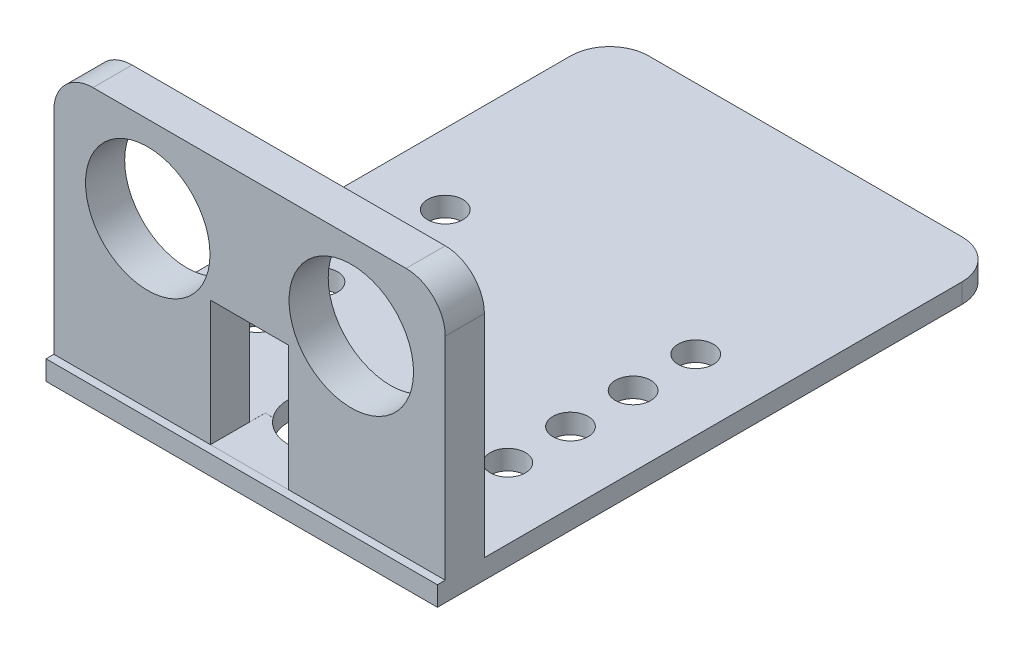
ISO-10303-21;
HEADER;
FILE_DESCRIPTION(('STEP AP214'),'2;1');
FILE_NAME('part.step','',(''),(''),'','','');
FILE_SCHEMA(('AUTOMOTIVE_DESIGN { 1 0 10303 214 1 1 1 1 }'));
ENDSEC;
DATA;
#1=APPLICATION_CONTEXT('core data for automotive mechanical design processes');
#2=APPLICATION_PROTOCOL_DEFINITION('international standard','automotive_design',2000,#1);
#3=PRODUCT_CONTEXT('',#1,'mechanical');
#4=PRODUCT('Part','Part','',(#3));
#5=PRODUCT_RELATED_PRODUCT_CATEGORY('part','',(#4));
#6=PRODUCT_DEFINITION_FORMATION('','',#4);
#7=PRODUCT_DEFINITION_CONTEXT('part definition',#1,'design');
#8=PRODUCT_DEFINITION('design','',#6,#7);
#9=PRODUCT_DEFINITION_SHAPE('','',#8);
#10=(LENGTH_UNIT() NAMED_UNIT(*) SI_UNIT(.MILLI.,.METRE.));
#11=(NAMED_UNIT(*) PLANE_ANGLE_UNIT() SI_UNIT($,.RADIAN.));
#12=(NAMED_UNIT(*) SI_UNIT($,.STERADIAN.) SOLID_ANGLE_UNIT());
#13=UNCERTAINTY_MEASURE_WITH_UNIT(LENGTH_MEASURE(1.E-05),#10,'distance_accuracy_value','');
#14=(GEOMETRIC_REPRESENTATION_CONTEXT(3) GLOBAL_UNCERTAINTY_ASSIGNED_CONTEXT((#13)) GLOBAL_UNIT_ASSIGNED_CONTEXT((#10,
#11,#12)) REPRESENTATION_CONTEXT('',''));
#15=CARTESIAN_POINT('',(0.,0.,0.));
#16=DIRECTION('',(0.,0.,1.));
#17=DIRECTION('',(1.,0.,0.));
#18=AXIS2_PLACEMENT_3D('',#15,#16,#17);
#19=CARTESIAN_POINT('',(0.,2.5,0.));
#20=DIRECTION('',(0.,-1.,0.));
#21=DIRECTION('',(0.,0.,-1.));
#22=AXIS2_PLACEMENT_3D('',#19,#20,#21);
#23=PLANE('',#22);
#24=DIRECTION('',(0.,0.,1.));
#25=VECTOR('',#24,1.);
#26=CARTESIAN_POINT('',(-25.,2.5,20.));
#27=LINE('',#26,#25);
#28=CARTESIAN_POINT('',(-25.,2.5,1.));
#29=VERTEX_POINT('',#28);
#30=CARTESIAN_POINT('',(-25.,2.5,2.));
#31=VERTEX_POINT('',#30);
#32=EDGE_CURVE('E312',#29,#31,#27,.T.);
#33=ORIENTED_EDGE('',*,*,#32,.T.);
#34=DIRECTION('',(1.,0.,0.));
#35=VECTOR('',#34,1.);
#36=CARTESIAN_POINT('',(-16.,2.5,2.));
#37=LINE('',#36,#35);
#38=CARTESIAN_POINT('',(25.,2.5,2.));
#39=VERTEX_POINT('',#38);
#40=EDGE_CURVE('E226',#31,#39,#37,.T.);
#41=ORIENTED_EDGE('',*,*,#40,.T.);
#42=DIRECTION('',(0.,0.,-1.));
#43=VECTOR('',#42,1.);
#44=CARTESIAN_POINT('',(25.,2.5,20.));
#45=LINE('',#44,#43);
#46=CARTESIAN_POINT('',(25.,2.5,1.));
#47=VERTEX_POINT('',#46);
#48=EDGE_CURVE('E209',#39,#47,#45,.T.);
#49=ORIENTED_EDGE('',*,*,#48,.T.);
#50=DIRECTION('',(1.,0.,0.));
#51=VECTOR('',#50,1.);
#52=CARTESIAN_POINT('',(0.,2.5,1.));
#53=LINE('',#52,#51);
#54=CARTESIAN_POINT('',(5.,2.5,1.));
#55=VERTEX_POINT('',#54);
#56=EDGE_CURVE('E233',#55,#47,#53,.T.);
#57=ORIENTED_EDGE('',*,*,#56,.F.);
#58=CARTESIAN_POINT('',(-5.,2.5,1.));
#59=VERTEX_POINT('',#58);
#60=EDGE_CURVE('E371',#59,#55,#53,.T.);
#61=ORIENTED_EDGE('',*,*,#60,.F.);
#62=EDGE_CURVE('E367',#29,#59,#53,.T.);
#63=ORIENTED_EDGE('',*,*,#62,.F.);
#64=EDGE_LOOP('',(#33,#41,#49,#57,#61,#63));
#65=FACE_BOUND('',#64,.T.);
#66=ADVANCED_FACE('F41',(#65),#23,.F.);
#67=CARTESIAN_POINT('',(16.,2.5,-24.));
#68=DIRECTION('',(0.,1.,0.));
#69=DIRECTION('',(0.,0.,-1.));
#70=AXIS2_PLACEMENT_3D('',#67,#68,#69);
#71=CIRCLE('',#70,2.25);
#72=CARTESIAN_POINT('',(16.,2.5,-26.25));
#73=VERTEX_POINT('',#72);
#74=EDGE_CURVE('E485',#73,#73,#71,.T.);
#75=ORIENTED_EDGE('',*,*,#74,.F.);
#76=EDGE_LOOP('',(#75));
#77=FACE_BOUND('',#76,.T.);
#78=CARTESIAN_POINT('',(16.0000000000001,2.5,-32.));
#79=DIRECTION('',(0.,1.,0.));
#80=DIRECTION('',(0.,0.,-1.));
#81=AXIS2_PLACEMENT_3D('',#78,#79,#80);
#82=CIRCLE('',#81,2.25);
#83=CARTESIAN_POINT('',(16.0000000000001,2.5,-34.25));
#84=VERTEX_POINT('',#83);
#85=EDGE_CURVE('E493',#84,#84,#82,.T.);
#86=ORIENTED_EDGE('',*,*,#85,.F.);
#87=EDGE_LOOP('',(#86));
#88=FACE_BOUND('',#87,.T.);
#89=CARTESIAN_POINT('',(16.0000000000001,2.5,-40.));
#90=DIRECTION('',(0.,1.,0.));
#91=DIRECTION('',(0.,0.,-1.));
#92=AXIS2_PLACEMENT_3D('',#89,#90,#91);
#93=CIRCLE('',#92,2.25);
#94=CARTESIAN_POINT('',(16.0000000000001,2.5,-42.25));
#95=VERTEX_POINT('',#94);
#96=EDGE_CURVE('E453',#95,#95,#93,.T.);
#97=ORIENTED_EDGE('',*,*,#96,.F.);
#98=EDGE_LOOP('',(#97));
#99=FACE_BOUND('',#98,.T.);
#100=CARTESIAN_POINT('',(-16.0000000000001,2.5,-40.));
#101=DIRECTION('',(0.,1.,0.));
#102=DIRECTION('',(0.,0.,1.));
#103=AXIS2_PLACEMENT_3D('',#100,#101,#102);
#104=CIRCLE('',#103,2.25);
#105=CARTESIAN_POINT('',(-16.0000000000001,2.5,-37.75));
#106=VERTEX_POINT('',#105);
#107=EDGE_CURVE('E462',#106,#106,#104,.T.);
#108=ORIENTED_EDGE('',*,*,#107,.F.);
#109=EDGE_LOOP('',(#108));
#110=FACE_BOUND('',#109,.T.);
#111=CARTESIAN_POINT('',(-16.0000000000001,2.5,-32.));
#112=DIRECTION('',(0.,1.,0.));
#113=DIRECTION('',(0.,0.,1.));
#114=AXIS2_PLACEMENT_3D('',#111,#112,#113);
#115=CIRCLE('',#114,2.25);
#116=CARTESIAN_POINT('',(-16.0000000000001,2.5,-29.75));
#117=VERTEX_POINT('',#116);
#118=EDGE_CURVE('E470',#117,#117,#115,.T.);
#119=ORIENTED_EDGE('',*,*,#118,.F.);
#120=EDGE_LOOP('',(#119));
#121=FACE_BOUND('',#120,.T.);
#122=CARTESIAN_POINT('',(-16.,2.5,-24.));
#123=DIRECTION('',(0.,1.,0.));
#124=DIRECTION('',(0.,0.,1.));
#125=AXIS2_PLACEMENT_3D('',#122,#123,#124);
#126=CIRCLE('',#125,2.25);
#127=CARTESIAN_POINT('',(-16.,2.5,-21.75));
#128=VERTEX_POINT('',#127);
#129=EDGE_CURVE('E478',#128,#128,#126,.T.);
#130=ORIENTED_EDGE('',*,*,#129,.F.);
#131=EDGE_LOOP('',(#130));
#132=FACE_BOUND('',#131,.T.);
#133=DIRECTION('',(1.,0.,0.));
#134=VECTOR('',#133,1.);
#135=CARTESIAN_POINT('',(25.,2.5,-70.));
#136=LINE('',#135,#134);
#137=CARTESIAN_POINT('',(-20.,2.5,-70.));
#138=VERTEX_POINT('',#137);
#139=CARTESIAN_POINT('',(20.,2.5,-70.));
#140=VERTEX_POINT('',#139);
#141=EDGE_CURVE('E211',#138,#140,#136,.T.);
#142=ORIENTED_EDGE('',*,*,#141,.F.);
#143=CARTESIAN_POINT('',(-20.,2.5,-65.));
#144=DIRECTION('',(0.,-1.,0.));
#145=DIRECTION('',(0.,0.,-1.));
#146=AXIS2_PLACEMENT_3D('',#143,#144,#145);
#147=CIRCLE('',#146,5.);
#148=CARTESIAN_POINT('',(-25.,2.5,-65.));
#149=VERTEX_POINT('',#148);
#150=EDGE_CURVE('E65',#138,#149,#147,.F.);
#151=ORIENTED_EDGE('',*,*,#150,.T.);
#152=CARTESIAN_POINT('',(-25.,2.5,-4.));
#153=VERTEX_POINT('',#152);
#154=EDGE_CURVE('E310',#149,#153,#27,.T.);
#155=ORIENTED_EDGE('',*,*,#154,.T.);
#156=DIRECTION('',(1.,0.,0.));
#157=VECTOR('',#156,1.);
#158=CARTESIAN_POINT('',(0.,2.5,-4.));
#159=LINE('',#158,#157);
#160=CARTESIAN_POINT('',(-5.,2.5,-4.));
#161=VERTEX_POINT('',#160);
#162=EDGE_CURVE('E361',#153,#161,#159,.T.);
#163=ORIENTED_EDGE('',*,*,#162,.T.);
#164=DIRECTION('',(0.,0.,-1.));
#165=VECTOR('',#164,1.);
#166=CARTESIAN_POINT('',(-5.,2.5,0.));
#167=LINE('',#166,#165);
#168=CARTESIAN_POINT('',(-5.,2.5,-6.));
#169=VERTEX_POINT('',#168);
#170=EDGE_CURVE('E384',#161,#169,#167,.T.);
#171=ORIENTED_EDGE('',*,*,#170,.T.);
#172=DIRECTION('',(1.,0.,0.));
#173=VECTOR('',#172,1.);
#174=CARTESIAN_POINT('',(0.,2.5,-6.));
#175=LINE('',#174,#173);
#176=CARTESIAN_POINT('',(-4.,2.5,-6.));
#177=VERTEX_POINT('',#176);
#178=EDGE_CURVE('E388',#169,#177,#175,.T.);
#179=ORIENTED_EDGE('',*,*,#178,.T.);
#180=CARTESIAN_POINT('',(0.,2.5,-9.));
#181=DIRECTION('',(0.,1.,0.));
#182=DIRECTION('',(0.,0.,1.));
#183=AXIS2_PLACEMENT_3D('',#180,#181,#182);
#184=CIRCLE('',#183,5.);
#185=CARTESIAN_POINT('',(4.,2.5,-6.));
#186=VERTEX_POINT('',#185);
#187=EDGE_CURVE('E234',#186,#177,#184,.T.);
#188=ORIENTED_EDGE('',*,*,#187,.F.);
#189=CARTESIAN_POINT('',(5.,2.5,-6.));
#190=VERTEX_POINT('',#189);
#191=EDGE_CURVE('E389',#186,#190,#175,.T.);
#192=ORIENTED_EDGE('',*,*,#191,.T.);
#193=DIRECTION('',(0.,0.,1.));
#194=VECTOR('',#193,1.);
#195=CARTESIAN_POINT('',(5.,2.5,0.));
#196=LINE('',#195,#194);
#197=CARTESIAN_POINT('',(5.,2.5,-4.));
#198=VERTEX_POINT('',#197);
#199=EDGE_CURVE('E262',#190,#198,#196,.T.);
#200=ORIENTED_EDGE('',*,*,#199,.T.);
#201=CARTESIAN_POINT('',(25.,2.5,-4.));
#202=VERTEX_POINT('',#201);
#203=EDGE_CURVE('E366',#198,#202,#159,.T.);
#204=ORIENTED_EDGE('',*,*,#203,.T.);
#205=CARTESIAN_POINT('',(25.,2.5,-65.));
#206=VERTEX_POINT('',#205);
#207=EDGE_CURVE('E199',#202,#206,#45,.T.);
#208=ORIENTED_EDGE('',*,*,#207,.T.);
#209=CARTESIAN_POINT('',(20.,2.5,-65.));
#210=DIRECTION('',(0.,-1.,0.));
#211=DIRECTION('',(0.,0.,-1.));
#212=AXIS2_PLACEMENT_3D('',#209,#210,#211);
#213=CIRCLE('',#212,5.);
#214=EDGE_CURVE('E57',#206,#140,#213,.F.);
#215=ORIENTED_EDGE('',*,*,#214,.T.);
#216=EDGE_LOOP('',(#142,#151,#155,#163,#171,#179,#188,#192,#200,#204,#208,#215));
#217=FACE_BOUND('',#216,.T.);
#218=CARTESIAN_POINT('',(-16.,2.5,-16.));
#219=DIRECTION('',(0.,1.,0.));
#220=DIRECTION('',(0.,0.,1.));
#221=AXIS2_PLACEMENT_3D('',#218,#219,#220);
#222=CIRCLE('',#221,2.25);
#223=CARTESIAN_POINT('',(-16.,2.5,-13.75));
#224=VERTEX_POINT('',#223);
#225=EDGE_CURVE('E217',#224,#224,#222,.T.);
#226=ORIENTED_EDGE('',*,*,#225,.F.);
#227=EDGE_LOOP('',(#226));
#228=FACE_BOUND('',#227,.T.);
#229=CARTESIAN_POINT('',(-16.,2.5,-8.));
#230=DIRECTION('',(0.,1.,0.));
#231=DIRECTION('',(0.,0.,1.));
#232=AXIS2_PLACEMENT_3D('',#229,#230,#231);
#233=CIRCLE('',#232,2.25);
#234=CARTESIAN_POINT('',(-16.,2.5,-5.75));
#235=VERTEX_POINT('',#234);
#236=EDGE_CURVE('E322',#235,#235,#233,.T.);
#237=ORIENTED_EDGE('',*,*,#236,.F.);
#238=EDGE_LOOP('',(#237));
#239=FACE_BOUND('',#238,.T.);
#240=CARTESIAN_POINT('',(16.,2.5,-16.));
#241=DIRECTION('',(0.,1.,0.));
#242=DIRECTION('',(0.,0.,1.));
#243=AXIS2_PLACEMENT_3D('',#240,#241,#242);
#244=CIRCLE('',#243,2.25);
#245=CARTESIAN_POINT('',(16.,2.5,-13.75));
#246=VERTEX_POINT('',#245);
#247=EDGE_CURVE('E328',#246,#246,#244,.T.);
#248=ORIENTED_EDGE('',*,*,#247,.F.);
#249=EDGE_LOOP('',(#248));
#250=FACE_BOUND('',#249,.T.);
#251=CARTESIAN_POINT('',(16.,2.5,-8.));
#252=DIRECTION('',(0.,1.,0.));
#253=DIRECTION('',(0.,0.,1.));
#254=AXIS2_PLACEMENT_3D('',#251,#252,#253);
#255=CIRCLE('',#254,2.25);
#256=CARTESIAN_POINT('',(16.,2.5,-5.75));
#257=VERTEX_POINT('',#256);
#258=EDGE_CURVE('E336',#257,#257,#255,.T.);
#259=ORIENTED_EDGE('',*,*,#258,.F.);
#260=EDGE_LOOP('',(#259));
#261=FACE_BOUND('',#260,.T.);
#262=ADVANCED_FACE('F511',(#77,#88,#99,#110,#121,#132,#217,#228,#239,#250,#261),#23,.F.);
#263=CARTESIAN_POINT('',(0.,0.,0.));
#264=DIRECTION('',(0.,-1.,0.));
#265=DIRECTION('',(0.,0.,-1.));
#266=AXIS2_PLACEMENT_3D('',#263,#264,#265);
#267=PLANE('',#266);
#268=CARTESIAN_POINT('',(16.,0.,-24.));
#269=DIRECTION('',(0.,1.,0.));
#270=DIRECTION('',(0.,0.,-1.));
#271=AXIS2_PLACEMENT_3D('',#268,#269,#270);
#272=CIRCLE('',#271,2.25);
#273=CARTESIAN_POINT('',(16.,0.,-26.25));
#274=VERTEX_POINT('',#273);
#275=EDGE_CURVE('E489',#274,#274,#272,.T.);
#276=ORIENTED_EDGE('',*,*,#275,.T.);
#277=EDGE_LOOP('',(#276));
#278=FACE_BOUND('',#277,.T.);
#279=CARTESIAN_POINT('',(16.0000000000001,0.,-32.));
#280=DIRECTION('',(0.,1.,0.));
#281=DIRECTION('',(0.,0.,-1.));
#282=AXIS2_PLACEMENT_3D('',#279,#280,#281);
#283=CIRCLE('',#282,2.25);
#284=CARTESIAN_POINT('',(16.0000000000001,0.,-34.25));
#285=VERTEX_POINT('',#284);
#286=EDGE_CURVE('E458',#285,#285,#283,.T.);
#287=ORIENTED_EDGE('',*,*,#286,.T.);
#288=EDGE_LOOP('',(#287));
#289=FACE_BOUND('',#288,.T.);
#290=CARTESIAN_POINT('',(16.0000000000001,0.,-40.));
#291=DIRECTION('',(0.,1.,0.));
#292=DIRECTION('',(0.,0.,-1.));
#293=AXIS2_PLACEMENT_3D('',#290,#291,#292);
#294=CIRCLE('',#293,2.25);
#295=CARTESIAN_POINT('',(16.0000000000001,0.,-42.25));
#296=VERTEX_POINT('',#295);
#297=EDGE_CURVE('E457',#296,#296,#294,.T.);
#298=ORIENTED_EDGE('',*,*,#297,.T.);
#299=EDGE_LOOP('',(#298));
#300=FACE_BOUND('',#299,.T.);
#301=CARTESIAN_POINT('',(-16.0000000000001,0.,-40.));
#302=DIRECTION('',(0.,1.,0.));
#303=DIRECTION('',(0.,0.,1.));
#304=AXIS2_PLACEMENT_3D('',#301,#302,#303);
#305=CIRCLE('',#304,2.25);
#306=CARTESIAN_POINT('',(-16.0000000000001,0.,-37.75));
#307=VERTEX_POINT('',#306);
#308=EDGE_CURVE('E466',#307,#307,#305,.T.);
#309=ORIENTED_EDGE('',*,*,#308,.T.);
#310=EDGE_LOOP('',(#309));
#311=FACE_BOUND('',#310,.T.);
#312=CARTESIAN_POINT('',(-16.0000000000001,0.,-32.));
#313=DIRECTION('',(0.,1.,0.));
#314=DIRECTION('',(0.,0.,1.));
#315=AXIS2_PLACEMENT_3D('',#312,#313,#314);
#316=CIRCLE('',#315,2.25);
#317=CARTESIAN_POINT('',(-16.0000000000001,0.,-29.75));
#318=VERTEX_POINT('',#317);
#319=EDGE_CURVE('E474',#318,#318,#316,.T.);
#320=ORIENTED_EDGE('',*,*,#319,.T.);
#321=EDGE_LOOP('',(#320));
#322=FACE_BOUND('',#321,.T.);
#323=CARTESIAN_POINT('',(-16.,0.,-24.));
#324=DIRECTION('',(0.,1.,0.));
#325=DIRECTION('',(0.,0.,1.));
#326=AXIS2_PLACEMENT_3D('',#323,#324,#325);
#327=CIRCLE('',#326,2.25);
#328=CARTESIAN_POINT('',(-16.,0.,-21.75));
#329=VERTEX_POINT('',#328);
#330=EDGE_CURVE('E452',#329,#329,#327,.T.);
#331=ORIENTED_EDGE('',*,*,#330,.T.);
#332=EDGE_LOOP('',(#331));
#333=FACE_BOUND('',#332,.T.);
#334=DIRECTION('',(0.,0.,1.));
#335=VECTOR('',#334,1.);
#336=CARTESIAN_POINT('',(-25.,0.,20.));
#337=LINE('',#336,#335);
#338=CARTESIAN_POINT('',(-25.,0.,-65.));
#339=VERTEX_POINT('',#338);
#340=CARTESIAN_POINT('',(-25.,0.,2.));
#341=VERTEX_POINT('',#340);
#342=EDGE_CURVE('E200',#339,#341,#337,.T.);
#343=ORIENTED_EDGE('',*,*,#342,.F.);
#344=CARTESIAN_POINT('',(-20.,0.,-65.));
#345=DIRECTION('',(0.,-1.,0.));
#346=DIRECTION('',(0.,0.,-1.));
#347=AXIS2_PLACEMENT_3D('',#344,#345,#346);
#348=CIRCLE('',#347,5.);
#349=CARTESIAN_POINT('',(-20.,0.,-70.));
#350=VERTEX_POINT('',#349);
#351=EDGE_CURVE('E11',#339,#350,#348,.T.);
#352=ORIENTED_EDGE('',*,*,#351,.T.);
#353=DIRECTION('',(-1.,0.,0.));
#354=VECTOR('',#353,1.);
#355=CARTESIAN_POINT('',(25.,0.,-70.));
#356=LINE('',#355,#354);
#357=CARTESIAN_POINT('',(20.,0.,-70.));
#358=VERTEX_POINT('',#357);
#359=EDGE_CURVE('E448',#358,#350,#356,.T.);
#360=ORIENTED_EDGE('',*,*,#359,.F.);
#361=CARTESIAN_POINT('',(20.,0.,-65.));
#362=DIRECTION('',(0.,-1.,0.));
#363=DIRECTION('',(0.,0.,-1.));
#364=AXIS2_PLACEMENT_3D('',#361,#362,#363);
#365=CIRCLE('',#364,5.);
#366=CARTESIAN_POINT('',(25.,0.,-65.));
#367=VERTEX_POINT('',#366);
#368=EDGE_CURVE('E50',#358,#367,#365,.T.);
#369=ORIENTED_EDGE('',*,*,#368,.T.);
#370=DIRECTION('',(0.,0.,-1.));
#371=VECTOR('',#370,1.);
#372=CARTESIAN_POINT('',(25.,0.,20.));
#373=LINE('',#372,#371);
#374=CARTESIAN_POINT('',(25.,0.,2.));
#375=VERTEX_POINT('',#374);
#376=EDGE_CURVE('E206',#375,#367,#373,.T.);
#377=ORIENTED_EDGE('',*,*,#376,.F.);
#378=DIRECTION('',(1.,0.,0.));
#379=VECTOR('',#378,1.);
#380=CARTESIAN_POINT('',(12.,0.,2.));
#381=LINE('',#380,#379);
#382=EDGE_CURVE('E188',#341,#375,#381,.T.);
#383=ORIENTED_EDGE('',*,*,#382,.F.);
#384=EDGE_LOOP('',(#343,#352,#360,#369,#377,#383));
#385=FACE_BOUND('',#384,.T.);
#386=CARTESIAN_POINT('',(0.,0.,-9.));
#387=DIRECTION('',(0.,-1.,0.));
#388=DIRECTION('',(0.,0.,-1.));
#389=AXIS2_PLACEMENT_3D('',#386,#387,#388);
#390=CIRCLE('',#389,5.);
#391=CARTESIAN_POINT('',(0.,0.,-14.));
#392=VERTEX_POINT('',#391);
#393=EDGE_CURVE('E229',#392,#392,#390,.T.);
#394=ORIENTED_EDGE('',*,*,#393,.F.);
#395=EDGE_LOOP('',(#394));
#396=FACE_BOUND('',#395,.T.);
#397=CARTESIAN_POINT('',(16.,0.,-16.));
#398=DIRECTION('',(0.,1.,0.));
#399=DIRECTION('',(0.,0.,1.));
#400=AXIS2_PLACEMENT_3D('',#397,#398,#399);
#401=CIRCLE('',#400,2.25);
#402=CARTESIAN_POINT('',(16.,0.,-13.75));
#403=VERTEX_POINT('',#402);
#404=EDGE_CURVE('E332',#403,#403,#401,.T.);
#405=ORIENTED_EDGE('',*,*,#404,.T.);
#406=EDGE_LOOP('',(#405));
#407=FACE_BOUND('',#406,.T.);
#408=CARTESIAN_POINT('',(-16.,0.,-16.));
#409=DIRECTION('',(0.,1.,0.));
#410=DIRECTION('',(0.,0.,1.));
#411=AXIS2_PLACEMENT_3D('',#408,#409,#410);
#412=CIRCLE('',#411,2.25);
#413=CARTESIAN_POINT('',(-16.,0.,-13.75));
#414=VERTEX_POINT('',#413);
#415=EDGE_CURVE('E223',#414,#414,#412,.T.);
#416=ORIENTED_EDGE('',*,*,#415,.T.);
#417=EDGE_LOOP('',(#416));
#418=FACE_BOUND('',#417,.T.);
#419=CARTESIAN_POINT('',(-16.,0.,-8.));
#420=DIRECTION('',(0.,1.,0.));
#421=DIRECTION('',(0.,0.,1.));
#422=AXIS2_PLACEMENT_3D('',#419,#420,#421);
#423=CIRCLE('',#422,2.25);
#424=CARTESIAN_POINT('',(-16.,0.,-5.75));
#425=VERTEX_POINT('',#424);
#426=EDGE_CURVE('E324',#425,#425,#423,.T.);
#427=ORIENTED_EDGE('',*,*,#426,.T.);
#428=EDGE_LOOP('',(#427));
#429=FACE_BOUND('',#428,.T.);
#430=CARTESIAN_POINT('',(16.,0.,-8.));
#431=DIRECTION('',(0.,1.,0.));
#432=DIRECTION('',(0.,0.,1.));
#433=AXIS2_PLACEMENT_3D('',#430,#431,#432);
#434=CIRCLE('',#433,2.25);
#435=CARTESIAN_POINT('',(16.,0.,-5.75));
#436=VERTEX_POINT('',#435);
#437=EDGE_CURVE('E340',#436,#436,#434,.T.);
#438=ORIENTED_EDGE('',*,*,#437,.T.);
#439=EDGE_LOOP('',(#438));
#440=FACE_BOUND('',#439,.T.);
#441=ADVANCED_FACE('F213',(#278,#289,#300,#311,#322,#333,#385,#396,#407,#418,#429,#440),#267,.T.);
#442=CARTESIAN_POINT('',(25.,2.5,20.));
#443=DIRECTION('',(-1.,0.,0.));
#444=DIRECTION('',(0.,0.,1.));
#445=AXIS2_PLACEMENT_3D('',#442,#443,#444);
#446=PLANE('',#445);
#447=DIRECTION('',(0.,-1.,0.));
#448=VECTOR('',#447,1.);
#449=CARTESIAN_POINT('',(25.,34.5,-4.));
#450=LINE('',#449,#448);
#451=CARTESIAN_POINT('',(25.,29.5,-4.));
#452=VERTEX_POINT('',#451);
#453=EDGE_CURVE('E353',#452,#202,#450,.T.);
#454=ORIENTED_EDGE('',*,*,#453,.F.);
#455=DIRECTION('',(0.,0.,-1.));
#456=VECTOR('',#455,1.);
#457=CARTESIAN_POINT('',(25.,29.5,1.));
#458=LINE('',#457,#456);
#459=CARTESIAN_POINT('',(25.,29.5,1.));
#460=VERTEX_POINT('',#459);
#461=EDGE_CURVE('E282',#452,#460,#458,.F.);
#462=ORIENTED_EDGE('',*,*,#461,.T.);
#463=DIRECTION('',(0.,-1.,0.));
#464=VECTOR('',#463,1.);
#465=CARTESIAN_POINT('',(25.,34.5,1.));
#466=LINE('',#465,#464);
#467=EDGE_CURVE('E350',#460,#47,#466,.T.);
#468=ORIENTED_EDGE('',*,*,#467,.T.);
#469=ORIENTED_EDGE('',*,*,#48,.F.);
#470=DIRECTION('',(0.,1.,0.));
#471=VECTOR('',#470,1.);
#472=CARTESIAN_POINT('',(25.,0.,2.));
#473=LINE('',#472,#471);
#474=EDGE_CURVE('E191',#375,#39,#473,.T.);
#475=ORIENTED_EDGE('',*,*,#474,.F.);
#476=ORIENTED_EDGE('',*,*,#376,.T.);
#477=DIRECTION('',(0.,-1.,0.));
#478=VECTOR('',#477,1.);
#479=CARTESIAN_POINT('',(25.,2.5,-65.));
#480=LINE('',#479,#478);
#481=EDGE_CURVE('E279',#367,#206,#480,.F.);
#482=ORIENTED_EDGE('',*,*,#481,.T.);
#483=ORIENTED_EDGE('',*,*,#207,.F.);
#484=EDGE_LOOP('',(#454,#462,#468,#469,#475,#476,#482,#483));
#485=FACE_BOUND('',#484,.T.);
#486=ADVANCED_FACE('F205',(#485),#446,.F.);
#487=CARTESIAN_POINT('',(-25.,2.5,20.));
#488=DIRECTION('',(1.,0.,0.));
#489=DIRECTION('',(0.,0.,-1.));
#490=AXIS2_PLACEMENT_3D('',#487,#488,#489);
#491=PLANE('',#490);
#492=DIRECTION('',(0.,-1.,0.));
#493=VECTOR('',#492,1.);
#494=CARTESIAN_POINT('',(-25.,34.5,1.));
#495=LINE('',#494,#493);
#496=CARTESIAN_POINT('',(-25.,29.5,1.));
#497=VERTEX_POINT('',#496);
#498=EDGE_CURVE('E344',#497,#29,#495,.T.);
#499=ORIENTED_EDGE('',*,*,#498,.F.);
#500=DIRECTION('',(0.,0.,1.));
#501=VECTOR('',#500,1.);
#502=CARTESIAN_POINT('',(-25.,29.5,-4.));
#503=LINE('',#502,#501);
#504=CARTESIAN_POINT('',(-25.,29.5,-4.));
#505=VERTEX_POINT('',#504);
#506=EDGE_CURVE('E294',#497,#505,#503,.F.);
#507=ORIENTED_EDGE('',*,*,#506,.T.);
#508=DIRECTION('',(0.,-1.,0.));
#509=VECTOR('',#508,1.);
#510=CARTESIAN_POINT('',(-25.,34.5,-4.));
#511=LINE('',#510,#509);
#512=EDGE_CURVE('E356',#505,#153,#511,.T.);
#513=ORIENTED_EDGE('',*,*,#512,.T.);
#514=ORIENTED_EDGE('',*,*,#154,.F.);
#515=DIRECTION('',(0.,1.,0.));
#516=VECTOR('',#515,1.);
#517=CARTESIAN_POINT('',(-25.,0.,-65.));
#518=LINE('',#517,#516);
#519=EDGE_CURVE('E291',#149,#339,#518,.F.);
#520=ORIENTED_EDGE('',*,*,#519,.T.);
#521=ORIENTED_EDGE('',*,*,#342,.T.);
#522=DIRECTION('',(0.,1.,0.));
#523=VECTOR('',#522,1.);
#524=CARTESIAN_POINT('',(-25.,0.,2.));
#525=LINE('',#524,#523);
#526=EDGE_CURVE('E194',#341,#31,#525,.T.);
#527=ORIENTED_EDGE('',*,*,#526,.T.);
#528=ORIENTED_EDGE('',*,*,#32,.F.);
#529=EDGE_LOOP('',(#499,#507,#513,#514,#520,#521,#527,#528));
#530=FACE_BOUND('',#529,.T.);
#531=ADVANCED_FACE('F546',(#530),#491,.F.);
#532=CARTESIAN_POINT('',(12.,2.5,2.));
#533=DIRECTION('',(0.,0.,-1.));
#534=DIRECTION('',(-1.,0.,0.));
#535=AXIS2_PLACEMENT_3D('',#532,#533,#534);
#536=PLANE('',#535);
#537=ORIENTED_EDGE('',*,*,#382,.T.);
#538=ORIENTED_EDGE('',*,*,#474,.T.);
#539=ORIENTED_EDGE('',*,*,#40,.F.);
#540=ORIENTED_EDGE('',*,*,#526,.F.);
#541=EDGE_LOOP('',(#537,#538,#539,#540));
#542=FACE_BOUND('',#541,.T.);
#543=ADVANCED_FACE('F190',(#542),#536,.F.);
#544=CARTESIAN_POINT('',(-16.,2.5,-16.));
#545=DIRECTION('',(0.,-1.,0.));
#546=DIRECTION('',(0.,0.,-1.));
#547=AXIS2_PLACEMENT_3D('',#544,#545,#546);
#548=CYLINDRICAL_SURFACE('',#547,2.25);
#549=ORIENTED_EDGE('',*,*,#225,.T.);
#550=EDGE_LOOP('',(#549));
#551=FACE_BOUND('',#550,.T.);
#552=ORIENTED_EDGE('',*,*,#415,.F.);
#553=EDGE_LOOP('',(#552));
#554=FACE_BOUND('',#553,.T.);
#555=ADVANCED_FACE('F555',(#551,#554),#548,.F.);
#556=CARTESIAN_POINT('',(-16.,2.5,-8.));
#557=DIRECTION('',(0.,-1.,0.));
#558=DIRECTION('',(0.,0.,-1.));
#559=AXIS2_PLACEMENT_3D('',#556,#557,#558);
#560=CYLINDRICAL_SURFACE('',#559,2.25);
#561=ORIENTED_EDGE('',*,*,#236,.T.);
#562=EDGE_LOOP('',(#561));
#563=FACE_BOUND('',#562,.T.);
#564=ORIENTED_EDGE('',*,*,#426,.F.);
#565=EDGE_LOOP('',(#564));
#566=FACE_BOUND('',#565,.T.);
#567=ADVANCED_FACE('F558',(#563,#566),#560,.F.);
#568=CARTESIAN_POINT('',(16.,2.5,-16.));
#569=DIRECTION('',(0.,-1.,0.));
#570=DIRECTION('',(0.,0.,-1.));
#571=AXIS2_PLACEMENT_3D('',#568,#569,#570);
#572=CYLINDRICAL_SURFACE('',#571,2.25);
#573=ORIENTED_EDGE('',*,*,#247,.T.);
#574=EDGE_LOOP('',(#573));
#575=FACE_BOUND('',#574,.T.);
#576=ORIENTED_EDGE('',*,*,#404,.F.);
#577=EDGE_LOOP('',(#576));
#578=FACE_BOUND('',#577,.T.);
#579=ADVANCED_FACE('F536',(#575,#578),#572,.F.);
#580=CARTESIAN_POINT('',(16.,2.5,-8.));
#581=DIRECTION('',(0.,-1.,0.));
#582=DIRECTION('',(0.,0.,-1.));
#583=AXIS2_PLACEMENT_3D('',#580,#581,#582);
#584=CYLINDRICAL_SURFACE('',#583,2.25);
#585=ORIENTED_EDGE('',*,*,#258,.T.);
#586=EDGE_LOOP('',(#585));
#587=FACE_BOUND('',#586,.T.);
#588=ORIENTED_EDGE('',*,*,#437,.F.);
#589=EDGE_LOOP('',(#588));
#590=FACE_BOUND('',#589,.T.);
#591=ADVANCED_FACE('F532',(#587,#590),#584,.F.);
#592=CARTESIAN_POINT('',(0.,34.5,1.));
#593=DIRECTION('',(0.,0.,-1.));
#594=DIRECTION('',(-1.,0.,0.));
#595=AXIS2_PLACEMENT_3D('',#592,#593,#594);
#596=PLANE('',#595);
#597=CARTESIAN_POINT('',(-13.,23.5,1.));
#598=DIRECTION('',(0.,0.,1.));
#599=DIRECTION('',(1.,0.,0.));
#600=AXIS2_PLACEMENT_3D('',#597,#598,#599);
#601=CIRCLE('',#600,7.95);
#602=CARTESIAN_POINT('',(-5.05,23.5,1.));
#603=VERTEX_POINT('',#602);
#604=EDGE_CURVE('E393',#603,#603,#601,.T.);
#605=ORIENTED_EDGE('',*,*,#604,.F.);
#606=EDGE_LOOP('',(#605));
#607=FACE_BOUND('',#606,.T.);
#608=CARTESIAN_POINT('',(13.,23.5,1.));
#609=DIRECTION('',(0.,0.,1.));
#610=DIRECTION('',(1.,0.,0.));
#611=AXIS2_PLACEMENT_3D('',#608,#609,#610);
#612=CIRCLE('',#611,7.95);
#613=CARTESIAN_POINT('',(20.95,23.5,1.));
#614=VERTEX_POINT('',#613);
#615=EDGE_CURVE('E409',#614,#614,#612,.T.);
#616=ORIENTED_EDGE('',*,*,#615,.F.);
#617=EDGE_LOOP('',(#616));
#618=FACE_BOUND('',#617,.T.);
#619=ORIENTED_EDGE('',*,*,#467,.F.);
#620=CARTESIAN_POINT('',(20.,29.5,1.));
#621=DIRECTION('',(0.,0.,-1.));
#622=DIRECTION('',(-1.,0.,0.));
#623=AXIS2_PLACEMENT_3D('',#620,#621,#622);
#624=CIRCLE('',#623,5.);
#625=CARTESIAN_POINT('',(20.,34.5,1.));
#626=VERTEX_POINT('',#625);
#627=EDGE_CURVE('E288',#460,#626,#624,.F.);
#628=ORIENTED_EDGE('',*,*,#627,.T.);
#629=DIRECTION('',(1.,0.,0.));
#630=VECTOR('',#629,1.);
#631=CARTESIAN_POINT('',(0.,34.5,1.));
#632=LINE('',#631,#630);
#633=CARTESIAN_POINT('',(-20.,34.5,1.));
#634=VERTEX_POINT('',#633);
#635=EDGE_CURVE('E365',#634,#626,#632,.T.);
#636=ORIENTED_EDGE('',*,*,#635,.F.);
#637=CARTESIAN_POINT('',(-20.,29.5,1.));
#638=DIRECTION('',(0.,0.,-1.));
#639=DIRECTION('',(-1.,0.,0.));
#640=AXIS2_PLACEMENT_3D('',#637,#638,#639);
#641=CIRCLE('',#640,5.);
#642=EDGE_CURVE('E285',#634,#497,#641,.F.);
#643=ORIENTED_EDGE('',*,*,#642,.T.);
#644=ORIENTED_EDGE('',*,*,#498,.T.);
#645=ORIENTED_EDGE('',*,*,#62,.T.);
#646=DIRECTION('',(0.,-1.,0.));
#647=VECTOR('',#646,1.);
#648=CARTESIAN_POINT('',(-5.00000000000011,18.494306312131,1.));
#649=LINE('',#648,#647);
#650=CARTESIAN_POINT('',(-5.00000000000011,18.494306312131,1.));
#651=VERTEX_POINT('',#650);
#652=EDGE_CURVE('E420',#651,#59,#649,.T.);
#653=ORIENTED_EDGE('',*,*,#652,.F.);
#654=DIRECTION('',(-1.,0.,0.));
#655=VECTOR('',#654,1.);
#656=CARTESIAN_POINT('',(-5.00000000000011,18.494306312131,1.));
#657=LINE('',#656,#655);
#658=CARTESIAN_POINT('',(4.99999999999989,18.494306312131,1.));
#659=VERTEX_POINT('',#658);
#660=EDGE_CURVE('E425',#659,#651,#657,.T.);
#661=ORIENTED_EDGE('',*,*,#660,.F.);
#662=DIRECTION('',(0.,1.,0.));
#663=VECTOR('',#662,1.);
#664=CARTESIAN_POINT('',(4.99999999999989,18.494306312131,1.));
#665=LINE('',#664,#663);
#666=EDGE_CURVE('E415',#55,#659,#665,.T.);
#667=ORIENTED_EDGE('',*,*,#666,.F.);
#668=ORIENTED_EDGE('',*,*,#56,.T.);
#669=EDGE_LOOP('',(#619,#628,#636,#643,#644,#645,#653,#661,#667,#668));
#670=FACE_BOUND('',#669,.T.);
#671=ADVANCED_FACE('F535',(#607,#618,#670),#596,.F.);
#672=CARTESIAN_POINT('',(0.,34.5,-4.));
#673=DIRECTION('',(0.,0.,-1.));
#674=DIRECTION('',(-1.,0.,0.));
#675=AXIS2_PLACEMENT_3D('',#672,#673,#674);
#676=PLANE('',#675);
#677=CARTESIAN_POINT('',(-13.,23.5,-4.));
#678=DIRECTION('',(0.,0.,-1.));
#679=DIRECTION('',(-1.,0.,0.));
#680=AXIS2_PLACEMENT_3D('',#677,#678,#679);
#681=CIRCLE('',#680,7.95);
#682=CARTESIAN_POINT('',(-20.95,23.5,-4.));
#683=VERTEX_POINT('',#682);
#684=EDGE_CURVE('E261',#683,#683,#681,.T.);
#685=ORIENTED_EDGE('',*,*,#684,.F.);
#686=EDGE_LOOP('',(#685));
#687=FACE_BOUND('',#686,.T.);
#688=CARTESIAN_POINT('',(13.,23.5,-4.));
#689=DIRECTION('',(0.,0.,-1.));
#690=DIRECTION('',(-1.,0.,0.));
#691=AXIS2_PLACEMENT_3D('',#688,#689,#690);
#692=CIRCLE('',#691,7.95);
#693=CARTESIAN_POINT('',(5.05,23.5,-4.));
#694=VERTEX_POINT('',#693);
#695=EDGE_CURVE('E257',#694,#694,#692,.T.);
#696=ORIENTED_EDGE('',*,*,#695,.F.);
#697=EDGE_LOOP('',(#696));
#698=FACE_BOUND('',#697,.T.);
#699=DIRECTION('',(1.,0.,0.));
#700=VECTOR('',#699,1.);
#701=CARTESIAN_POINT('',(0.,34.5,-4.));
#702=LINE('',#701,#700);
#703=CARTESIAN_POINT('',(-20.,34.5,-4.));
#704=VERTEX_POINT('',#703);
#705=CARTESIAN_POINT('',(20.,34.5,-4.));
#706=VERTEX_POINT('',#705);
#707=EDGE_CURVE('E360',#704,#706,#702,.T.);
#708=ORIENTED_EDGE('',*,*,#707,.T.);
#709=CARTESIAN_POINT('',(20.,29.5,-4.));
#710=DIRECTION('',(0.,0.,-1.));
#711=DIRECTION('',(-1.,0.,0.));
#712=AXIS2_PLACEMENT_3D('',#709,#710,#711);
#713=CIRCLE('',#712,5.);
#714=EDGE_CURVE('E276',#706,#452,#713,.T.);
#715=ORIENTED_EDGE('',*,*,#714,.T.);
#716=ORIENTED_EDGE('',*,*,#453,.T.);
#717=ORIENTED_EDGE('',*,*,#203,.F.);
#718=DIRECTION('',(0.,-1.,0.));
#719=VECTOR('',#718,1.);
#720=CARTESIAN_POINT('',(4.99999999999977,34.5,-4.));
#721=LINE('',#720,#719);
#722=CARTESIAN_POINT('',(4.99999999999989,18.494306312131,-4.));
#723=VERTEX_POINT('',#722);
#724=EDGE_CURVE('E253',#723,#198,#721,.T.);
#725=ORIENTED_EDGE('',*,*,#724,.F.);
#726=DIRECTION('',(1.,0.,0.));
#727=VECTOR('',#726,1.);
#728=CARTESIAN_POINT('',(0.,18.494306312131,-4.));
#729=LINE('',#728,#727);
#730=CARTESIAN_POINT('',(-5.00000000000011,18.494306312131,-4.));
#731=VERTEX_POINT('',#730);
#732=EDGE_CURVE('E250',#731,#723,#729,.T.);
#733=ORIENTED_EDGE('',*,*,#732,.F.);
#734=DIRECTION('',(0.,1.,0.));
#735=VECTOR('',#734,1.);
#736=CARTESIAN_POINT('',(-5.00000000000023,34.5,-4.));
#737=LINE('',#736,#735);
#738=EDGE_CURVE('E247',#161,#731,#737,.T.);
#739=ORIENTED_EDGE('',*,*,#738,.F.);
#740=ORIENTED_EDGE('',*,*,#162,.F.);
#741=ORIENTED_EDGE('',*,*,#512,.F.);
#742=CARTESIAN_POINT('',(-20.,29.5,-4.));
#743=DIRECTION('',(0.,0.,-1.));
#744=DIRECTION('',(-1.,0.,0.));
#745=AXIS2_PLACEMENT_3D('',#742,#743,#744);
#746=CIRCLE('',#745,5.);
#747=EDGE_CURVE('E273',#505,#704,#746,.T.);
#748=ORIENTED_EDGE('',*,*,#747,.T.);
#749=EDGE_LOOP('',(#708,#715,#716,#717,#725,#733,#739,#740,#741,#748));
#750=FACE_BOUND('',#749,.T.);
#751=ADVANCED_FACE('F568',(#687,#698,#750),#676,.T.);
#752=CARTESIAN_POINT('',(0.,34.5,0.));
#753=DIRECTION('',(0.,1.,0.));
#754=DIRECTION('',(0.,0.,1.));
#755=AXIS2_PLACEMENT_3D('',#752,#753,#754);
#756=PLANE('',#755);
#757=ORIENTED_EDGE('',*,*,#635,.T.);
#758=DIRECTION('',(0.,0.,-1.));
#759=VECTOR('',#758,1.);
#760=CARTESIAN_POINT('',(20.,34.5,-4.));
#761=LINE('',#760,#759);
#762=EDGE_CURVE('E269',#626,#706,#761,.T.);
#763=ORIENTED_EDGE('',*,*,#762,.T.);
#764=ORIENTED_EDGE('',*,*,#707,.F.);
#765=DIRECTION('',(0.,0.,1.));
#766=VECTOR('',#765,1.);
#767=CARTESIAN_POINT('',(-20.,34.5,1.));
#768=LINE('',#767,#766);
#769=EDGE_CURVE('E256',#704,#634,#768,.T.);
#770=ORIENTED_EDGE('',*,*,#769,.T.);
#771=EDGE_LOOP('',(#757,#763,#764,#770));
#772=FACE_BOUND('',#771,.T.);
#773=ADVANCED_FACE('F572',(#772),#756,.T.);
#774=CARTESIAN_POINT('',(0.,-4.5,-9.));
#775=DIRECTION('',(0.,1.,0.));
#776=DIRECTION('',(0.,0.,1.));
#777=AXIS2_PLACEMENT_3D('',#774,#775,#776);
#778=CYLINDRICAL_SURFACE('',#777,5.);
#779=ORIENTED_EDGE('',*,*,#393,.T.);
#780=EDGE_LOOP('',(#779));
#781=FACE_BOUND('',#780,.T.);
#782=ORIENTED_EDGE('',*,*,#187,.T.);
#783=DIRECTION('',(0.,1.,0.));
#784=VECTOR('',#783,1.);
#785=CARTESIAN_POINT('',(-4.,-4.5,-6.));
#786=LINE('',#785,#784);
#787=CARTESIAN_POINT('',(-4.,2.49430631213102,-6.));
#788=VERTEX_POINT('',#787);
#789=EDGE_CURVE('E243',#177,#788,#786,.F.);
#790=ORIENTED_EDGE('',*,*,#789,.T.);
#791=CARTESIAN_POINT('',(0.,2.49430631213102,-9.));
#792=DIRECTION('',(0.,-1.,0.));
#793=DIRECTION('',(1.,0.,0.));
#794=AXIS2_PLACEMENT_3D('',#791,#792,#793);
#795=CIRCLE('',#794,5.);
#796=CARTESIAN_POINT('',(4.,2.49430631213103,-6.));
#797=VERTEX_POINT('',#796);
#798=EDGE_CURVE('E239',#788,#797,#795,.F.);
#799=ORIENTED_EDGE('',*,*,#798,.T.);
#800=DIRECTION('',(0.,1.,0.));
#801=VECTOR('',#800,1.);
#802=CARTESIAN_POINT('',(4.,-4.5,-6.));
#803=LINE('',#802,#801);
#804=EDGE_CURVE('E235',#797,#186,#803,.T.);
#805=ORIENTED_EDGE('',*,*,#804,.T.);
#806=EDGE_LOOP('',(#782,#790,#799,#805));
#807=FACE_BOUND('',#806,.T.);
#808=ADVANCED_FACE('F576',(#781,#807),#778,.F.);
#809=CARTESIAN_POINT('',(0.,0.,1.));
#810=DIRECTION('',(0.,0.,-1.));
#811=DIRECTION('',(-1.,0.,0.));
#812=AXIS2_PLACEMENT_3D('',#809,#810,#811);
#813=PLANE('',#812);
#814=ORIENTED_EDGE('',*,*,#60,.T.);
#815=CARTESIAN_POINT('',(5.,2.49430631213103,1.));
#816=VERTEX_POINT('',#815);
#817=EDGE_CURVE('E410',#816,#55,#665,.T.);
#818=ORIENTED_EDGE('',*,*,#817,.F.);
#819=DIRECTION('',(1.,0.,0.));
#820=VECTOR('',#819,1.);
#821=CARTESIAN_POINT('',(-5.,2.49430631213102,1.));
#822=LINE('',#821,#820);
#823=CARTESIAN_POINT('',(-5.,2.49430631213102,1.));
#824=VERTEX_POINT('',#823);
#825=EDGE_CURVE('E416',#824,#816,#822,.T.);
#826=ORIENTED_EDGE('',*,*,#825,.F.);
#827=EDGE_CURVE('E424',#59,#824,#649,.T.);
#828=ORIENTED_EDGE('',*,*,#827,.F.);
#829=EDGE_LOOP('',(#814,#818,#826,#828));
#830=FACE_BOUND('',#829,.T.);
#831=ADVANCED_FACE('F580',(#830),#813,.T.);
#832=CARTESIAN_POINT('',(4.99999999999989,18.494306312131,-6.));
#833=DIRECTION('',(1.,0.,0.));
#834=DIRECTION('',(0.,1.,0.));
#835=AXIS2_PLACEMENT_3D('',#832,#833,#834);
#836=PLANE('',#835);
#837=DIRECTION('',(0.,1.,0.));
#838=VECTOR('',#837,1.);
#839=CARTESIAN_POINT('',(4.99999999999989,18.494306312131,-6.));
#840=LINE('',#839,#838);
#841=CARTESIAN_POINT('',(5.,2.49430631213103,-6.));
#842=VERTEX_POINT('',#841);
#843=EDGE_CURVE('E399',#842,#190,#840,.T.);
#844=ORIENTED_EDGE('',*,*,#843,.F.);
#845=DIRECTION('',(0.,0.,1.));
#846=VECTOR('',#845,1.);
#847=CARTESIAN_POINT('',(5.,2.49430631213103,-6.));
#848=LINE('',#847,#846);
#849=EDGE_CURVE('E403',#842,#816,#848,.T.);
#850=ORIENTED_EDGE('',*,*,#849,.T.);
#851=ORIENTED_EDGE('',*,*,#817,.T.);
#852=ORIENTED_EDGE('',*,*,#666,.T.);
#853=DIRECTION('',(0.,0.,1.));
#854=VECTOR('',#853,1.);
#855=CARTESIAN_POINT('',(4.99999999999989,18.494306312131,-6.));
#856=LINE('',#855,#854);
#857=EDGE_CURVE('E406',#723,#659,#856,.T.);
#858=ORIENTED_EDGE('',*,*,#857,.F.);
#859=ORIENTED_EDGE('',*,*,#724,.T.);
#860=ORIENTED_EDGE('',*,*,#199,.F.);
#861=EDGE_LOOP('',(#844,#850,#851,#852,#858,#859,#860));
#862=FACE_BOUND('',#861,.T.);
#863=ADVANCED_FACE('F592',(#862),#836,.F.);
#864=CARTESIAN_POINT('',(-5.00000000000011,18.494306312131,-6.));
#865=DIRECTION('',(-1.,0.,0.));
#866=DIRECTION('',(0.,-1.,0.));
#867=AXIS2_PLACEMENT_3D('',#864,#865,#866);
#868=PLANE('',#867);
#869=ORIENTED_EDGE('',*,*,#738,.T.);
#870=DIRECTION('',(0.,0.,1.));
#871=VECTOR('',#870,1.);
#872=CARTESIAN_POINT('',(-5.00000000000011,18.494306312131,-6.));
#873=LINE('',#872,#871);
#874=EDGE_CURVE('E394',#731,#651,#873,.T.);
#875=ORIENTED_EDGE('',*,*,#874,.T.);
#876=ORIENTED_EDGE('',*,*,#652,.T.);
#877=ORIENTED_EDGE('',*,*,#827,.T.);
#878=DIRECTION('',(0.,0.,1.));
#879=VECTOR('',#878,1.);
#880=CARTESIAN_POINT('',(-5.,2.49430631213102,-6.));
#881=LINE('',#880,#879);
#882=CARTESIAN_POINT('',(-5.,2.49430631213102,-6.));
#883=VERTEX_POINT('',#882);
#884=EDGE_CURVE('E398',#883,#824,#881,.T.);
#885=ORIENTED_EDGE('',*,*,#884,.F.);
#886=DIRECTION('',(0.,-1.,0.));
#887=VECTOR('',#886,1.);
#888=CARTESIAN_POINT('',(-5.00000000000011,18.494306312131,-6.));
#889=LINE('',#888,#887);
#890=EDGE_CURVE('E414',#169,#883,#889,.T.);
#891=ORIENTED_EDGE('',*,*,#890,.F.);
#892=ORIENTED_EDGE('',*,*,#170,.F.);
#893=EDGE_LOOP('',(#869,#875,#876,#877,#885,#891,#892));
#894=FACE_BOUND('',#893,.T.);
#895=ADVANCED_FACE('F588',(#894),#868,.F.);
#896=CARTESIAN_POINT('',(-5.,2.49430631213102,-6.));
#897=DIRECTION('',(0.,-1.,0.));
#898=DIRECTION('',(1.,0.,0.));
#899=AXIS2_PLACEMENT_3D('',#896,#897,#898);
#900=PLANE('',#899);
#901=DIRECTION('',(1.,0.,0.));
#902=VECTOR('',#901,1.);
#903=CARTESIAN_POINT('',(-5.,2.49430631213102,-6.));
#904=LINE('',#903,#902);
#905=EDGE_CURVE('E431',#883,#788,#904,.T.);
#906=ORIENTED_EDGE('',*,*,#905,.F.);
#907=ORIENTED_EDGE('',*,*,#884,.T.);
#908=ORIENTED_EDGE('',*,*,#825,.T.);
#909=ORIENTED_EDGE('',*,*,#849,.F.);
#910=EDGE_CURVE('E435',#797,#842,#904,.T.);
#911=ORIENTED_EDGE('',*,*,#910,.F.);
#912=ORIENTED_EDGE('',*,*,#798,.F.);
#913=EDGE_LOOP('',(#906,#907,#908,#909,#911,#912));
#914=FACE_BOUND('',#913,.T.);
#915=ADVANCED_FACE('F591',(#914),#900,.F.);
#916=CARTESIAN_POINT('',(0.,0.,-6.));
#917=DIRECTION('',(0.,0.,-1.));
#918=DIRECTION('',(-1.,0.,0.));
#919=AXIS2_PLACEMENT_3D('',#916,#917,#918);
#920=PLANE('',#919);
#921=ORIENTED_EDGE('',*,*,#890,.T.);
#922=ORIENTED_EDGE('',*,*,#905,.T.);
#923=ORIENTED_EDGE('',*,*,#789,.F.);
#924=ORIENTED_EDGE('',*,*,#178,.F.);
#925=EDGE_LOOP('',(#921,#922,#923,#924));
#926=FACE_BOUND('',#925,.T.);
#927=ADVANCED_FACE('F596',(#926),#920,.F.);
#928=ORIENTED_EDGE('',*,*,#804,.F.);
#929=ORIENTED_EDGE('',*,*,#910,.T.);
#930=ORIENTED_EDGE('',*,*,#843,.T.);
#931=ORIENTED_EDGE('',*,*,#191,.F.);
#932=EDGE_LOOP('',(#928,#929,#930,#931));
#933=FACE_BOUND('',#932,.T.);
#934=ADVANCED_FACE('F586',(#933),#920,.F.);
#935=CARTESIAN_POINT('',(-5.00000000000011,18.494306312131,-6.));
#936=DIRECTION('',(0.,1.,0.));
#937=DIRECTION('',(-1.,0.,0.));
#938=AXIS2_PLACEMENT_3D('',#935,#936,#937);
#939=PLANE('',#938);
#940=ORIENTED_EDGE('',*,*,#732,.T.);
#941=ORIENTED_EDGE('',*,*,#857,.T.);
#942=ORIENTED_EDGE('',*,*,#660,.T.);
#943=ORIENTED_EDGE('',*,*,#874,.F.);
#944=EDGE_LOOP('',(#940,#941,#942,#943));
#945=FACE_BOUND('',#944,.T.);
#946=ADVANCED_FACE('F582',(#945),#939,.F.);
#947=CARTESIAN_POINT('',(13.,23.5,-6.));
#948=DIRECTION('',(0.,0.,1.));
#949=DIRECTION('',(1.,0.,0.));
#950=AXIS2_PLACEMENT_3D('',#947,#948,#949);
#951=CYLINDRICAL_SURFACE('',#950,7.95);
#952=ORIENTED_EDGE('',*,*,#695,.T.);
#953=EDGE_LOOP('',(#952));
#954=FACE_BOUND('',#953,.T.);
#955=ORIENTED_EDGE('',*,*,#615,.T.);
#956=EDGE_LOOP('',(#955));
#957=FACE_BOUND('',#956,.T.);
#958=ADVANCED_FACE('F585',(#954,#957),#951,.F.);
#959=CARTESIAN_POINT('',(-13.,23.5,-6.));
#960=DIRECTION('',(0.,0.,1.));
#961=DIRECTION('',(1.,0.,0.));
#962=AXIS2_PLACEMENT_3D('',#959,#960,#961);
#963=CYLINDRICAL_SURFACE('',#962,7.95);
#964=ORIENTED_EDGE('',*,*,#684,.T.);
#965=EDGE_LOOP('',(#964));
#966=FACE_BOUND('',#965,.T.);
#967=ORIENTED_EDGE('',*,*,#604,.T.);
#968=EDGE_LOOP('',(#967));
#969=FACE_BOUND('',#968,.T.);
#970=ADVANCED_FACE('F609',(#966,#969),#963,.F.);
#971=CARTESIAN_POINT('',(0.,0.,-70.));
#972=DIRECTION('',(0.,0.,-1.));
#973=DIRECTION('',(-1.,0.,0.));
#974=AXIS2_PLACEMENT_3D('',#971,#972,#973);
#975=PLANE('',#974);
#976=ORIENTED_EDGE('',*,*,#359,.T.);
#977=DIRECTION('',(0.,1.,0.));
#978=VECTOR('',#977,1.);
#979=CARTESIAN_POINT('',(-20.,2.5,-70.));
#980=LINE('',#979,#978);
#981=EDGE_CURVE('E301',#350,#138,#980,.T.);
#982=ORIENTED_EDGE('',*,*,#981,.T.);
#983=ORIENTED_EDGE('',*,*,#141,.T.);
#984=DIRECTION('',(0.,-1.,0.));
#985=VECTOR('',#984,1.);
#986=CARTESIAN_POINT('',(20.,0.,-70.));
#987=LINE('',#986,#985);
#988=EDGE_CURVE('E297',#140,#358,#987,.T.);
#989=ORIENTED_EDGE('',*,*,#988,.T.);
#990=EDGE_LOOP('',(#976,#982,#983,#989));
#991=FACE_BOUND('',#990,.T.);
#992=ADVANCED_FACE('F613',(#991),#975,.T.);
#993=CARTESIAN_POINT('',(-16.,0.,-24.));
#994=DIRECTION('',(0.,1.,0.));
#995=DIRECTION('',(0.,0.,1.));
#996=AXIS2_PLACEMENT_3D('',#993,#994,#995);
#997=CYLINDRICAL_SURFACE('',#996,2.25);
#998=ORIENTED_EDGE('',*,*,#330,.F.);
#999=EDGE_LOOP('',(#998));
#1000=FACE_BOUND('',#999,.T.);
#1001=ORIENTED_EDGE('',*,*,#129,.T.);
#1002=EDGE_LOOP('',(#1001));
#1003=FACE_BOUND('',#1002,.T.);
#1004=ADVANCED_FACE('F617',(#1000,#1003),#997,.F.);
#1005=CARTESIAN_POINT('',(-16.0000000000001,0.,-32.));
#1006=DIRECTION('',(0.,1.,0.));
#1007=DIRECTION('',(0.,0.,1.));
#1008=AXIS2_PLACEMENT_3D('',#1005,#1006,#1007);
#1009=CYLINDRICAL_SURFACE('',#1008,2.25);
#1010=ORIENTED_EDGE('',*,*,#319,.F.);
#1011=EDGE_LOOP('',(#1010));
#1012=FACE_BOUND('',#1011,.T.);
#1013=ORIENTED_EDGE('',*,*,#118,.T.);
#1014=EDGE_LOOP('',(#1013));
#1015=FACE_BOUND('',#1014,.T.);
#1016=ADVANCED_FACE('F625',(#1012,#1015),#1009,.F.);
#1017=CARTESIAN_POINT('',(-16.0000000000001,0.,-40.));
#1018=DIRECTION('',(0.,1.,0.));
#1019=DIRECTION('',(0.,0.,1.));
#1020=AXIS2_PLACEMENT_3D('',#1017,#1018,#1019);
#1021=CYLINDRICAL_SURFACE('',#1020,2.25);
#1022=ORIENTED_EDGE('',*,*,#308,.F.);
#1023=EDGE_LOOP('',(#1022));
#1024=FACE_BOUND('',#1023,.T.);
#1025=ORIENTED_EDGE('',*,*,#107,.T.);
#1026=EDGE_LOOP('',(#1025));
#1027=FACE_BOUND('',#1026,.T.);
#1028=ADVANCED_FACE('F621',(#1024,#1027),#1021,.F.);
#1029=CARTESIAN_POINT('',(16.0000000000001,0.,-40.));
#1030=DIRECTION('',(0.,1.,0.));
#1031=DIRECTION('',(0.,0.,1.));
#1032=AXIS2_PLACEMENT_3D('',#1029,#1030,#1031);
#1033=CYLINDRICAL_SURFACE('',#1032,2.25);
#1034=ORIENTED_EDGE('',*,*,#297,.F.);
#1035=EDGE_LOOP('',(#1034));
#1036=FACE_BOUND('',#1035,.T.);
#1037=ORIENTED_EDGE('',*,*,#96,.T.);
#1038=EDGE_LOOP('',(#1037));
#1039=FACE_BOUND('',#1038,.T.);
#1040=ADVANCED_FACE('F507',(#1036,#1039),#1033,.F.);
#1041=CARTESIAN_POINT('',(16.0000000000001,0.,-32.));
#1042=DIRECTION('',(0.,1.,0.));
#1043=DIRECTION('',(0.,0.,1.));
#1044=AXIS2_PLACEMENT_3D('',#1041,#1042,#1043);
#1045=CYLINDRICAL_SURFACE('',#1044,2.25);
#1046=ORIENTED_EDGE('',*,*,#286,.F.);
#1047=EDGE_LOOP('',(#1046));
#1048=FACE_BOUND('',#1047,.T.);
#1049=ORIENTED_EDGE('',*,*,#85,.T.);
#1050=EDGE_LOOP('',(#1049));
#1051=FACE_BOUND('',#1050,.T.);
#1052=ADVANCED_FACE('F503',(#1048,#1051),#1045,.F.);
#1053=CARTESIAN_POINT('',(16.,0.,-24.));
#1054=DIRECTION('',(0.,1.,0.));
#1055=DIRECTION('',(0.,0.,1.));
#1056=AXIS2_PLACEMENT_3D('',#1053,#1054,#1055);
#1057=CYLINDRICAL_SURFACE('',#1056,2.25);
#1058=ORIENTED_EDGE('',*,*,#275,.F.);
#1059=EDGE_LOOP('',(#1058));
#1060=FACE_BOUND('',#1059,.T.);
#1061=ORIENTED_EDGE('',*,*,#74,.T.);
#1062=EDGE_LOOP('',(#1061));
#1063=FACE_BOUND('',#1062,.T.);
#1064=ADVANCED_FACE('F506',(#1060,#1063),#1057,.F.);
#1065=CARTESIAN_POINT('',(20.,29.5,0.));
#1066=DIRECTION('',(0.,0.,1.));
#1067=DIRECTION('',(1.,0.,0.));
#1068=AXIS2_PLACEMENT_3D('',#1065,#1066,#1067);
#1069=CYLINDRICAL_SURFACE('',#1068,5.);
#1070=ORIENTED_EDGE('',*,*,#627,.F.);
#1071=ORIENTED_EDGE('',*,*,#461,.F.);
#1072=ORIENTED_EDGE('',*,*,#714,.F.);
#1073=ORIENTED_EDGE('',*,*,#762,.F.);
#1074=EDGE_LOOP('',(#1070,#1071,#1072,#1073));
#1075=FACE_BOUND('',#1074,.T.);
#1076=ADVANCED_FACE('F634',(#1075),#1069,.T.);
#1077=CARTESIAN_POINT('',(-20.,29.5,0.));
#1078=DIRECTION('',(0.,0.,-1.));
#1079=DIRECTION('',(-1.,0.,0.));
#1080=AXIS2_PLACEMENT_3D('',#1077,#1078,#1079);
#1081=CYLINDRICAL_SURFACE('',#1080,5.);
#1082=ORIENTED_EDGE('',*,*,#747,.F.);
#1083=ORIENTED_EDGE('',*,*,#506,.F.);
#1084=ORIENTED_EDGE('',*,*,#642,.F.);
#1085=ORIENTED_EDGE('',*,*,#769,.F.);
#1086=EDGE_LOOP('',(#1082,#1083,#1084,#1085));
#1087=FACE_BOUND('',#1086,.T.);
#1088=ADVANCED_FACE('F639',(#1087),#1081,.T.);
#1089=CARTESIAN_POINT('',(-20.,0.,-65.));
#1090=DIRECTION('',(0.,-1.,0.));
#1091=DIRECTION('',(0.,0.,-1.));
#1092=AXIS2_PLACEMENT_3D('',#1089,#1090,#1091);
#1093=CYLINDRICAL_SURFACE('',#1092,5.);
#1094=ORIENTED_EDGE('',*,*,#351,.F.);
#1095=ORIENTED_EDGE('',*,*,#519,.F.);
#1096=ORIENTED_EDGE('',*,*,#150,.F.);
#1097=ORIENTED_EDGE('',*,*,#981,.F.);
#1098=EDGE_LOOP('',(#1094,#1095,#1096,#1097));
#1099=FACE_BOUND('',#1098,.T.);
#1100=ADVANCED_FACE('F648',(#1099),#1093,.T.);
#1101=CARTESIAN_POINT('',(20.,0.,-65.));
#1102=DIRECTION('',(0.,1.,0.));
#1103=DIRECTION('',(0.,0.,1.));
#1104=AXIS2_PLACEMENT_3D('',#1101,#1102,#1103);
#1105=CYLINDRICAL_SURFACE('',#1104,5.);
#1106=ORIENTED_EDGE('',*,*,#214,.F.);
#1107=ORIENTED_EDGE('',*,*,#481,.F.);
#1108=ORIENTED_EDGE('',*,*,#368,.F.);
#1109=ORIENTED_EDGE('',*,*,#988,.F.);
#1110=EDGE_LOOP('',(#1106,#1107,#1108,#1109));
#1111=FACE_BOUND('',#1110,.T.);
#1112=ADVANCED_FACE('F43',(#1111),#1105,.T.);
#1113=CLOSED_SHELL('',(#66,#262,#441,#486,#531,#543,#555,#567,#579,#591,#671,#751,#773,#808,
#831,#863,#895,#915,#927,#934,#946,#958,#970,#992,#1004,#1016,#1028,#1040,#1052,#1064,#1076,
#1088,#1100,#1112));
#1114=MANIFOLD_SOLID_BREP('B2',#1113);
#1115=ADVANCED_BREP_SHAPE_REPRESENTATION('',(#18,#1114),#14);
#1116=SHAPE_DEFINITION_REPRESENTATION(#9,#1115);
ENDSEC;
END-ISO-10303-21;
